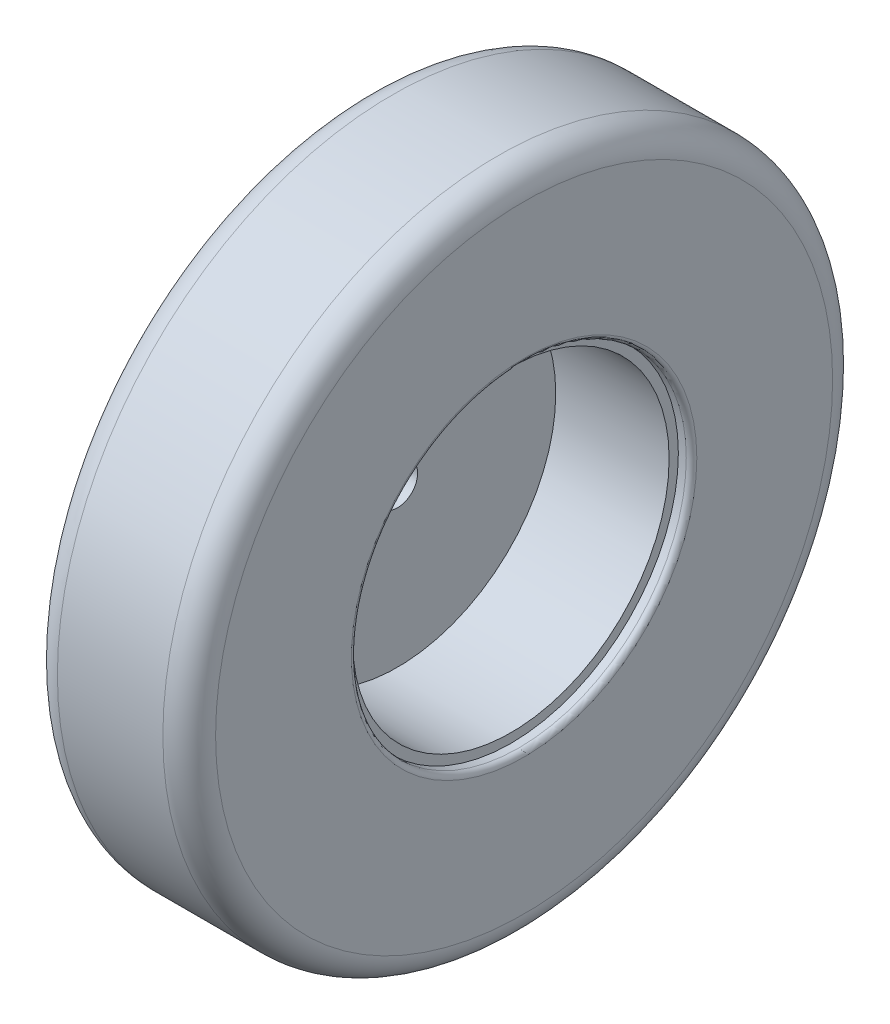
ISO-10303-21;
HEADER;
FILE_DESCRIPTION(('STEP AP214'),'2;1');
FILE_NAME('part.step','',(''),(''),'','','');
FILE_SCHEMA(('AUTOMOTIVE_DESIGN { 1 0 10303 214 1 1 1 1 }'));
ENDSEC;
DATA;
#1=APPLICATION_CONTEXT('core data for automotive mechanical design processes');
#2=APPLICATION_PROTOCOL_DEFINITION('international standard','automotive_design',2000,#1);
#3=PRODUCT_CONTEXT('',#1,'mechanical');
#4=PRODUCT('Part','Part','',(#3));
#5=PRODUCT_RELATED_PRODUCT_CATEGORY('part','',(#4));
#6=PRODUCT_DEFINITION_FORMATION('','',#4);
#7=PRODUCT_DEFINITION_CONTEXT('part definition',#1,'design');
#8=PRODUCT_DEFINITION('design','',#6,#7);
#9=PRODUCT_DEFINITION_SHAPE('','',#8);
#10=(LENGTH_UNIT() NAMED_UNIT(*) SI_UNIT(.MILLI.,.METRE.));
#11=(NAMED_UNIT(*) PLANE_ANGLE_UNIT() SI_UNIT($,.RADIAN.));
#12=(NAMED_UNIT(*) SI_UNIT($,.STERADIAN.) SOLID_ANGLE_UNIT());
#13=UNCERTAINTY_MEASURE_WITH_UNIT(LENGTH_MEASURE(1.E-05),#10,'distance_accuracy_value','');
#14=(GEOMETRIC_REPRESENTATION_CONTEXT(3) GLOBAL_UNCERTAINTY_ASSIGNED_CONTEXT((#13)) GLOBAL_UNIT_ASSIGNED_CONTEXT((#10,
#11,#12)) REPRESENTATION_CONTEXT('',''));
#15=CARTESIAN_POINT('',(0.,0.,0.));
#16=DIRECTION('',(0.,0.,1.));
#17=DIRECTION('',(1.,0.,0.));
#18=AXIS2_PLACEMENT_3D('',#15,#16,#17);
#19=CARTESIAN_POINT('',(12.,0.,0.));
#20=DIRECTION('',(1.,0.,0.));
#21=DIRECTION('',(0.,0.,-1.));
#22=AXIS2_PLACEMENT_3D('',#19,#20,#21);
#23=PLANE('',#22);
#24=CARTESIAN_POINT('',(12.,0.,0.));
#25=DIRECTION('',(1.,0.,0.));
#26=DIRECTION('',(0.,0.,-1.));
#27=AXIS2_PLACEMENT_3D('',#24,#25,#26);
#28=CIRCLE('',#27,7.625);
#29=CARTESIAN_POINT('',(12.,0.,-7.625));
#30=VERTEX_POINT('',#29);
#31=EDGE_CURVE('E68',#30,#30,#28,.T.);
#32=ORIENTED_EDGE('',*,*,#31,.F.);
#33=EDGE_LOOP('',(#32));
#34=FACE_BOUND('',#33,.T.);
#35=CARTESIAN_POINT('',(12.,0.,0.));
#36=DIRECTION('',(1.,0.,0.));
#37=DIRECTION('',(0.,0.,-1.));
#38=AXIS2_PLACEMENT_3D('',#35,#36,#37);
#39=CIRCLE('',#38,60.);
#40=CARTESIAN_POINT('',(12.,0.,-60.));
#41=VERTEX_POINT('',#40);
#42=EDGE_CURVE('E64',#41,#41,#39,.F.);
#43=ORIENTED_EDGE('',*,*,#42,.F.);
#44=EDGE_LOOP('',(#43));
#45=FACE_BOUND('',#44,.T.);
#46=ADVANCED_FACE('F32',(#34,#45),#23,.T.);
#47=CARTESIAN_POINT('',(5.,0.,0.));
#48=DIRECTION('',(1.,0.,0.));
#49=DIRECTION('',(0.,0.,-1.));
#50=AXIS2_PLACEMENT_3D('',#47,#48,#49);
#51=PLANE('',#50);
#52=CARTESIAN_POINT('',(5.,0.,0.));
#53=DIRECTION('',(1.,0.,0.));
#54=DIRECTION('',(0.,0.,-1.));
#55=AXIS2_PLACEMENT_3D('',#52,#53,#54);
#56=CIRCLE('',#55,63.5);
#57=CARTESIAN_POINT('',(5.,0.,-63.5));
#58=VERTEX_POINT('',#57);
#59=EDGE_CURVE('E65',#58,#58,#56,.T.);
#60=ORIENTED_EDGE('',*,*,#59,.F.);
#61=EDGE_LOOP('',(#60));
#62=FACE_BOUND('',#61,.T.);
#63=CARTESIAN_POINT('',(5.,0.,0.));
#64=DIRECTION('',(1.,0.,0.));
#65=DIRECTION('',(0.,0.,-1.));
#66=AXIS2_PLACEMENT_3D('',#63,#64,#65);
#67=CIRCLE('',#66,7.625);
#68=CARTESIAN_POINT('',(5.,0.,-7.625));
#69=VERTEX_POINT('',#68);
#70=EDGE_CURVE('E69',#69,#69,#67,.T.);
#71=ORIENTED_EDGE('',*,*,#70,.T.);
#72=EDGE_LOOP('',(#71));
#73=FACE_BOUND('',#72,.T.);
#74=ADVANCED_FACE('F105',(#62,#73),#51,.F.);
#75=CARTESIAN_POINT('',(12.,0.,0.));
#76=DIRECTION('',(-1.,0.,0.));
#77=DIRECTION('',(0.,0.,1.));
#78=AXIS2_PLACEMENT_3D('',#75,#76,#77);
#79=CYLINDRICAL_SURFACE('',#78,7.625);
#80=ORIENTED_EDGE('',*,*,#31,.T.);
#81=EDGE_LOOP('',(#80));
#82=FACE_BOUND('',#81,.T.);
#83=ORIENTED_EDGE('',*,*,#70,.F.);
#84=EDGE_LOOP('',(#83));
#85=FACE_BOUND('',#84,.T.);
#86=ADVANCED_FACE('F89',(#82,#85),#79,.F.);
#87=CARTESIAN_POINT('',(55.,0.,0.));
#88=DIRECTION('',(1.,0.,0.));
#89=DIRECTION('',(0.,0.,-1.));
#90=AXIS2_PLACEMENT_3D('',#87,#88,#89);
#91=PLANE('',#90);
#92=CARTESIAN_POINT('',(55.,0.,0.));
#93=DIRECTION('',(1.,0.,0.));
#94=DIRECTION('',(0.,0.,-1.));
#95=AXIS2_PLACEMENT_3D('',#92,#93,#94);
#96=CIRCLE('',#95,63.5);
#97=CARTESIAN_POINT('',(55.,0.,-63.5));
#98=VERTEX_POINT('',#97);
#99=EDGE_CURVE('E79',#98,#98,#96,.F.);
#100=ORIENTED_EDGE('',*,*,#99,.F.);
#101=EDGE_LOOP('',(#100));
#102=FACE_BOUND('',#101,.T.);
#103=CARTESIAN_POINT('',(55.,0.,0.));
#104=DIRECTION('',(1.,0.,0.));
#105=DIRECTION('',(0.,0.,-1.));
#106=AXIS2_PLACEMENT_3D('',#103,#104,#105);
#107=CIRCLE('',#106,60.);
#108=CARTESIAN_POINT('',(55.,0.,-60.));
#109=VERTEX_POINT('',#108);
#110=EDGE_CURVE('E72',#109,#109,#107,.T.);
#111=ORIENTED_EDGE('',*,*,#110,.F.);
#112=EDGE_LOOP('',(#111));
#113=FACE_BOUND('',#112,.T.);
#114=ADVANCED_FACE('F85',(#102,#113),#91,.T.);
#115=CARTESIAN_POINT('',(55.,0.,0.));
#116=DIRECTION('',(-1.,0.,0.));
#117=DIRECTION('',(0.,0.,1.));
#118=AXIS2_PLACEMENT_3D('',#115,#116,#117);
#119=CYLINDRICAL_SURFACE('',#118,60.);
#120=ORIENTED_EDGE('',*,*,#42,.T.);
#121=EDGE_LOOP('',(#120));
#122=FACE_BOUND('',#121,.T.);
#123=ORIENTED_EDGE('',*,*,#110,.T.);
#124=EDGE_LOOP('',(#123));
#125=FACE_BOUND('',#124,.T.);
#126=ADVANCED_FACE('F88',(#122,#125),#119,.F.);
#127=CARTESIAN_POINT('',(60.,0.,0.));
#128=DIRECTION('',(-1.,0.,0.));
#129=DIRECTION('',(0.,0.,1.));
#130=AXIS2_PLACEMENT_3D('',#127,#128,#129);
#131=CYLINDRICAL_SURFACE('',#130,63.5);
#132=CARTESIAN_POINT('',(2.,0.,0.));
#133=DIRECTION('',(1.,0.,0.));
#134=DIRECTION('',(0.,0.,-1.));
#135=AXIS2_PLACEMENT_3D('',#132,#133,#134);
#136=CIRCLE('',#135,63.5);
#137=CARTESIAN_POINT('',(2.,0.,-63.5));
#138=VERTEX_POINT('',#137);
#139=EDGE_CURVE('E43',#138,#138,#136,.F.);
#140=ORIENTED_EDGE('',*,*,#139,.T.);
#141=EDGE_LOOP('',(#140));
#142=FACE_BOUND('',#141,.T.);
#143=ORIENTED_EDGE('',*,*,#59,.T.);
#144=EDGE_LOOP('',(#143));
#145=FACE_BOUND('',#144,.T.);
#146=ADVANCED_FACE('F94',(#142,#145),#131,.F.);
#147=CARTESIAN_POINT('',(60.,0.,0.));
#148=DIRECTION('',(1.,0.,0.));
#149=DIRECTION('',(0.,0.,-1.));
#150=AXIS2_PLACEMENT_3D('',#147,#148,#149);
#151=PLANE('',#150);
#152=CARTESIAN_POINT('',(60.,0.,0.));
#153=DIRECTION('',(1.,0.,0.));
#154=DIRECTION('',(0.,0.,-1.));
#155=AXIS2_PLACEMENT_3D('',#152,#153,#154);
#156=CIRCLE('',#155,65.5);
#157=CARTESIAN_POINT('',(60.,0.,-65.5));
#158=VERTEX_POINT('',#157);
#159=EDGE_CURVE('E10',#158,#158,#156,.F.);
#160=ORIENTED_EDGE('',*,*,#159,.T.);
#161=EDGE_LOOP('',(#160));
#162=FACE_BOUND('',#161,.T.);
#163=CARTESIAN_POINT('',(60.,0.,0.));
#164=DIRECTION('',(1.,0.,0.));
#165=DIRECTION('',(0.,0.,-1.));
#166=AXIS2_PLACEMENT_3D('',#163,#164,#165);
#167=CIRCLE('',#166,117.);
#168=CARTESIAN_POINT('',(60.,0.,-117.));
#169=VERTEX_POINT('',#168);
#170=EDGE_CURVE('E52',#169,#169,#167,.T.);
#171=ORIENTED_EDGE('',*,*,#170,.T.);
#172=EDGE_LOOP('',(#171));
#173=FACE_BOUND('',#172,.T.);
#174=ADVANCED_FACE('F100',(#162,#173),#151,.T.);
#175=CARTESIAN_POINT('',(0.,0.,0.));
#176=DIRECTION('',(1.,0.,0.));
#177=DIRECTION('',(0.,0.,-1.));
#178=AXIS2_PLACEMENT_3D('',#175,#176,#177);
#179=PLANE('',#178);
#180=CARTESIAN_POINT('',(0.,0.,0.));
#181=DIRECTION('',(1.,0.,0.));
#182=DIRECTION('',(0.,0.,-1.));
#183=AXIS2_PLACEMENT_3D('',#180,#181,#182);
#184=CIRCLE('',#183,65.5);
#185=CARTESIAN_POINT('',(0.,0.,-65.5));
#186=VERTEX_POINT('',#185);
#187=EDGE_CURVE('E47',#186,#186,#184,.T.);
#188=ORIENTED_EDGE('',*,*,#187,.T.);
#189=EDGE_LOOP('',(#188));
#190=FACE_BOUND('',#189,.T.);
#191=CARTESIAN_POINT('',(0.,0.,0.));
#192=DIRECTION('',(1.,0.,0.));
#193=DIRECTION('',(0.,0.,-1.));
#194=AXIS2_PLACEMENT_3D('',#191,#192,#193);
#195=CIRCLE('',#194,117.);
#196=CARTESIAN_POINT('',(0.,0.,-117.));
#197=VERTEX_POINT('',#196);
#198=EDGE_CURVE('E55',#197,#197,#195,.F.);
#199=ORIENTED_EDGE('',*,*,#198,.T.);
#200=EDGE_LOOP('',(#199));
#201=FACE_BOUND('',#200,.T.);
#202=ADVANCED_FACE('F135',(#190,#201),#179,.F.);
#203=CARTESIAN_POINT('',(60.,0.,0.));
#204=DIRECTION('',(-1.,0.,0.));
#205=DIRECTION('',(0.,0.,1.));
#206=AXIS2_PLACEMENT_3D('',#203,#204,#205);
#207=CYLINDRICAL_SURFACE('',#206,127.);
#208=CARTESIAN_POINT('',(10.,0.,0.));
#209=DIRECTION('',(1.,0.,0.));
#210=DIRECTION('',(0.,0.,-1.));
#211=AXIS2_PLACEMENT_3D('',#208,#209,#210);
#212=CIRCLE('',#211,127.);
#213=CARTESIAN_POINT('',(10.,0.,-127.));
#214=VERTEX_POINT('',#213);
#215=EDGE_CURVE('E58',#214,#214,#212,.T.);
#216=ORIENTED_EDGE('',*,*,#215,.T.);
#217=EDGE_LOOP('',(#216));
#218=FACE_BOUND('',#217,.T.);
#219=CARTESIAN_POINT('',(50.,0.,0.));
#220=DIRECTION('',(1.,0.,0.));
#221=DIRECTION('',(0.,0.,-1.));
#222=AXIS2_PLACEMENT_3D('',#219,#220,#221);
#223=CIRCLE('',#222,127.);
#224=CARTESIAN_POINT('',(50.,0.,-127.));
#225=VERTEX_POINT('',#224);
#226=EDGE_CURVE('E61',#225,#225,#223,.F.);
#227=ORIENTED_EDGE('',*,*,#226,.T.);
#228=EDGE_LOOP('',(#227));
#229=FACE_BOUND('',#228,.T.);
#230=ADVANCED_FACE('F138',(#218,#229),#207,.T.);
#231=CARTESIAN_POINT('',(58.,0.,0.));
#232=DIRECTION('',(1.,0.,0.));
#233=DIRECTION('',(0.,0.,-1.));
#234=AXIS2_PLACEMENT_3D('',#231,#232,#233);
#235=CIRCLE('',#234,63.5);
#236=CARTESIAN_POINT('',(58.,0.,-63.5));
#237=VERTEX_POINT('',#236);
#238=EDGE_CURVE('E39',#237,#237,#235,.T.);
#239=ORIENTED_EDGE('',*,*,#238,.T.);
#240=EDGE_LOOP('',(#239));
#241=FACE_BOUND('',#240,.T.);
#242=ORIENTED_EDGE('',*,*,#99,.T.);
#243=EDGE_LOOP('',(#242));
#244=FACE_BOUND('',#243,.T.);
#245=ADVANCED_FACE('F83',(#241,#244),#131,.F.);
#246=CARTESIAN_POINT('',(10.,0.,0.));
#247=DIRECTION('',(1.,0.,0.));
#248=DIRECTION('',(0.,0.,-1.));
#249=AXIS2_PLACEMENT_3D('',#246,#247,#248);
#250=TOROIDAL_SURFACE('',#249,117.,10.);
#251=ORIENTED_EDGE('',*,*,#198,.F.);
#252=EDGE_LOOP('',(#251));
#253=FACE_BOUND('',#252,.T.);
#254=ORIENTED_EDGE('',*,*,#215,.F.);
#255=EDGE_LOOP('',(#254));
#256=FACE_BOUND('',#255,.T.);
#257=ADVANCED_FACE('F117',(#253,#256),#250,.T.);
#258=CARTESIAN_POINT('',(50.,0.,0.));
#259=DIRECTION('',(1.,0.,0.));
#260=DIRECTION('',(0.,0.,-1.));
#261=AXIS2_PLACEMENT_3D('',#258,#259,#260);
#262=TOROIDAL_SURFACE('',#261,117.,10.);
#263=ORIENTED_EDGE('',*,*,#226,.F.);
#264=EDGE_LOOP('',(#263));
#265=FACE_BOUND('',#264,.T.);
#266=ORIENTED_EDGE('',*,*,#170,.F.);
#267=EDGE_LOOP('',(#266));
#268=FACE_BOUND('',#267,.T.);
#269=ADVANCED_FACE('F120',(#265,#268),#262,.T.);
#270=CARTESIAN_POINT('',(2.,0.,0.));
#271=DIRECTION('',(1.,0.,0.));
#272=DIRECTION('',(0.,0.,-1.));
#273=AXIS2_PLACEMENT_3D('',#270,#271,#272);
#274=TOROIDAL_SURFACE('',#273,65.5,2.);
#275=ORIENTED_EDGE('',*,*,#139,.F.);
#276=EDGE_LOOP('',(#275));
#277=FACE_BOUND('',#276,.T.);
#278=ORIENTED_EDGE('',*,*,#187,.F.);
#279=EDGE_LOOP('',(#278));
#280=FACE_BOUND('',#279,.T.);
#281=ADVANCED_FACE('F123',(#277,#280),#274,.T.);
#282=CARTESIAN_POINT('',(58.,0.,0.));
#283=DIRECTION('',(1.,0.,0.));
#284=DIRECTION('',(0.,0.,-1.));
#285=AXIS2_PLACEMENT_3D('',#282,#283,#284);
#286=TOROIDAL_SURFACE('',#285,65.5,2.);
#287=ORIENTED_EDGE('',*,*,#159,.F.);
#288=EDGE_LOOP('',(#287));
#289=FACE_BOUND('',#288,.T.);
#290=ORIENTED_EDGE('',*,*,#238,.F.);
#291=EDGE_LOOP('',(#290));
#292=FACE_BOUND('',#291,.T.);
#293=ADVANCED_FACE('F34',(#289,#292),#286,.T.);
#294=CLOSED_SHELL('',(#46,#74,#86,#114,#126,#146,#174,#202,#230,#245,#257,#269,#281,#293));
#295=MANIFOLD_SOLID_BREP('B2',#294);
#296=ADVANCED_BREP_SHAPE_REPRESENTATION('',(#18,#295),#14);
#297=SHAPE_DEFINITION_REPRESENTATION(#9,#296);
ENDSEC;
END-ISO-10303-21;
